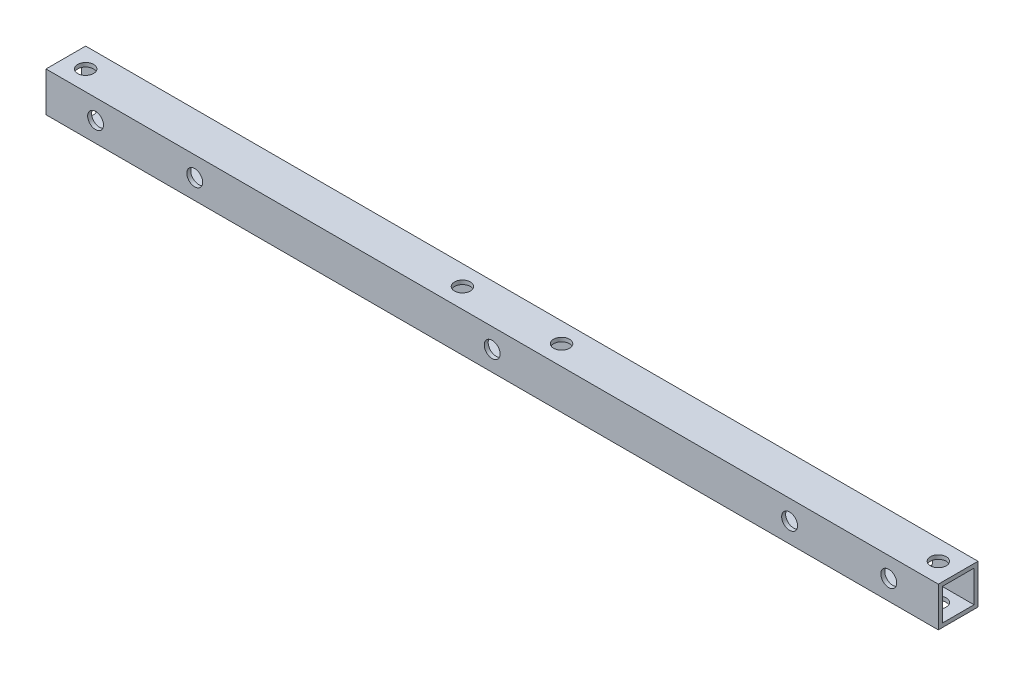
ISO-10303-21;
HEADER;
FILE_DESCRIPTION(('STEP AP214'),'2;1');
FILE_NAME('part.step','',(''),(''),'','','');
FILE_SCHEMA(('AUTOMOTIVE_DESIGN { 1 0 10303 214 1 1 1 1 }'));
ENDSEC;
DATA;
#1=APPLICATION_CONTEXT('core data for automotive mechanical design processes');
#2=APPLICATION_PROTOCOL_DEFINITION('international standard','automotive_design',2000,#1);
#3=PRODUCT_CONTEXT('',#1,'mechanical');
#4=PRODUCT('Part','Part','',(#3));
#5=PRODUCT_RELATED_PRODUCT_CATEGORY('part','',(#4));
#6=PRODUCT_DEFINITION_FORMATION('','',#4);
#7=PRODUCT_DEFINITION_CONTEXT('part definition',#1,'design');
#8=PRODUCT_DEFINITION('design','',#6,#7);
#9=PRODUCT_DEFINITION_SHAPE('','',#8);
#10=(LENGTH_UNIT() NAMED_UNIT(*) SI_UNIT(.MILLI.,.METRE.));
#11=(NAMED_UNIT(*) PLANE_ANGLE_UNIT() SI_UNIT($,.RADIAN.));
#12=(NAMED_UNIT(*) SI_UNIT($,.STERADIAN.) SOLID_ANGLE_UNIT());
#13=UNCERTAINTY_MEASURE_WITH_UNIT(LENGTH_MEASURE(1.E-05),#10,'distance_accuracy_value','');
#14=(GEOMETRIC_REPRESENTATION_CONTEXT(3) GLOBAL_UNCERTAINTY_ASSIGNED_CONTEXT((#13)) GLOBAL_UNIT_ASSIGNED_CONTEXT((#10,
#11,#12)) REPRESENTATION_CONTEXT('',''));
#15=CARTESIAN_POINT('',(0.,0.,0.));
#16=DIRECTION('',(0.,0.,1.));
#17=DIRECTION('',(1.,0.,0.));
#18=AXIS2_PLACEMENT_3D('',#15,#16,#17);
#19=CARTESIAN_POINT('',(225.,0.,0.));
#20=DIRECTION('',(1.,0.,0.));
#21=DIRECTION('',(0.,0.,-1.));
#22=AXIS2_PLACEMENT_3D('',#19,#20,#21);
#23=PLANE('',#22);
#24=DIRECTION('',(0.,1.,0.));
#25=VECTOR('',#24,1.);
#26=CARTESIAN_POINT('',(225.,5.,-5.));
#27=LINE('',#26,#25);
#28=CARTESIAN_POINT('',(225.,-5.,-5.));
#29=VERTEX_POINT('',#28);
#30=CARTESIAN_POINT('',(225.,5.,-5.));
#31=VERTEX_POINT('',#30);
#32=EDGE_CURVE('E166',#29,#31,#27,.T.);
#33=ORIENTED_EDGE('',*,*,#32,.T.);
#34=DIRECTION('',(0.,0.,1.));
#35=VECTOR('',#34,1.);
#36=CARTESIAN_POINT('',(225.,5.,5.));
#37=LINE('',#36,#35);
#38=CARTESIAN_POINT('',(225.,5.,5.));
#39=VERTEX_POINT('',#38);
#40=EDGE_CURVE('E169',#31,#39,#37,.T.);
#41=ORIENTED_EDGE('',*,*,#40,.T.);
#42=DIRECTION('',(0.,-1.,0.));
#43=VECTOR('',#42,1.);
#44=CARTESIAN_POINT('',(225.,5.,5.));
#45=LINE('',#44,#43);
#46=CARTESIAN_POINT('',(225.,-5.,5.));
#47=VERTEX_POINT('',#46);
#48=EDGE_CURVE('E172',#39,#47,#45,.T.);
#49=ORIENTED_EDGE('',*,*,#48,.T.);
#50=DIRECTION('',(0.,0.,-1.));
#51=VECTOR('',#50,1.);
#52=CARTESIAN_POINT('',(225.,-5.,5.));
#53=LINE('',#52,#51);
#54=EDGE_CURVE('E174',#47,#29,#53,.T.);
#55=ORIENTED_EDGE('',*,*,#54,.T.);
#56=EDGE_LOOP('',(#33,#41,#49,#55));
#57=FACE_BOUND('',#56,.T.);
#58=DIRECTION('',(0.,0.,1.));
#59=VECTOR('',#58,1.);
#60=CARTESIAN_POINT('',(225.,4.,5.));
#61=LINE('',#60,#59);
#62=CARTESIAN_POINT('',(225.,4.,-4.));
#63=VERTEX_POINT('',#62);
#64=CARTESIAN_POINT('',(225.,4.,4.));
#65=VERTEX_POINT('',#64);
#66=EDGE_CURVE('E136',#63,#65,#61,.T.);
#67=ORIENTED_EDGE('',*,*,#66,.F.);
#68=DIRECTION('',(0.,1.,0.));
#69=VECTOR('',#68,1.);
#70=CARTESIAN_POINT('',(225.,5.,-4.));
#71=LINE('',#70,#69);
#72=CARTESIAN_POINT('',(225.,-4.,-4.));
#73=VERTEX_POINT('',#72);
#74=EDGE_CURVE('E128',#73,#63,#71,.T.);
#75=ORIENTED_EDGE('',*,*,#74,.F.);
#76=DIRECTION('',(0.,0.,-1.));
#77=VECTOR('',#76,1.);
#78=CARTESIAN_POINT('',(225.,-4.,5.));
#79=LINE('',#78,#77);
#80=CARTESIAN_POINT('',(225.,-4.,4.));
#81=VERTEX_POINT('',#80);
#82=EDGE_CURVE('E150',#81,#73,#79,.T.);
#83=ORIENTED_EDGE('',*,*,#82,.F.);
#84=DIRECTION('',(0.,-1.,0.));
#85=VECTOR('',#84,1.);
#86=CARTESIAN_POINT('',(225.,5.,4.));
#87=LINE('',#86,#85);
#88=EDGE_CURVE('E148',#65,#81,#87,.T.);
#89=ORIENTED_EDGE('',*,*,#88,.F.);
#90=EDGE_LOOP('',(#67,#75,#83,#89));
#91=FACE_BOUND('',#90,.T.);
#92=ADVANCED_FACE('F61',(#57,#91),#23,.T.);
#93=CARTESIAN_POINT('',(0.,0.,0.));
#94=DIRECTION('',(1.,0.,0.));
#95=DIRECTION('',(0.,0.,-1.));
#96=AXIS2_PLACEMENT_3D('',#93,#94,#95);
#97=PLANE('',#96);
#98=DIRECTION('',(0.,1.,0.));
#99=VECTOR('',#98,1.);
#100=CARTESIAN_POINT('',(0.,5.,-5.));
#101=LINE('',#100,#99);
#102=CARTESIAN_POINT('',(0.,-5.,-5.));
#103=VERTEX_POINT('',#102);
#104=CARTESIAN_POINT('',(0.,5.,-5.));
#105=VERTEX_POINT('',#104);
#106=EDGE_CURVE('E144',#103,#105,#101,.T.);
#107=ORIENTED_EDGE('',*,*,#106,.F.);
#108=DIRECTION('',(0.,0.,-1.));
#109=VECTOR('',#108,1.);
#110=CARTESIAN_POINT('',(0.,-5.,5.));
#111=LINE('',#110,#109);
#112=CARTESIAN_POINT('',(0.,-5.,5.));
#113=VERTEX_POINT('',#112);
#114=EDGE_CURVE('E170',#113,#103,#111,.T.);
#115=ORIENTED_EDGE('',*,*,#114,.F.);
#116=DIRECTION('',(0.,-1.,0.));
#117=VECTOR('',#116,1.);
#118=CARTESIAN_POINT('',(0.,5.,5.));
#119=LINE('',#118,#117);
#120=CARTESIAN_POINT('',(0.,5.,5.));
#121=VERTEX_POINT('',#120);
#122=EDGE_CURVE('E181',#121,#113,#119,.T.);
#123=ORIENTED_EDGE('',*,*,#122,.F.);
#124=DIRECTION('',(0.,0.,1.));
#125=VECTOR('',#124,1.);
#126=CARTESIAN_POINT('',(0.,5.,5.));
#127=LINE('',#126,#125);
#128=EDGE_CURVE('E179',#105,#121,#127,.T.);
#129=ORIENTED_EDGE('',*,*,#128,.F.);
#130=EDGE_LOOP('',(#107,#115,#123,#129));
#131=FACE_BOUND('',#130,.T.);
#132=DIRECTION('',(0.,1.,0.));
#133=VECTOR('',#132,1.);
#134=CARTESIAN_POINT('',(0.,5.,-4.));
#135=LINE('',#134,#133);
#136=CARTESIAN_POINT('',(0.,-4.,-4.));
#137=VERTEX_POINT('',#136);
#138=CARTESIAN_POINT('',(0.,4.,-4.));
#139=VERTEX_POINT('',#138);
#140=EDGE_CURVE('E86',#137,#139,#135,.T.);
#141=ORIENTED_EDGE('',*,*,#140,.T.);
#142=DIRECTION('',(0.,0.,1.));
#143=VECTOR('',#142,1.);
#144=CARTESIAN_POINT('',(0.,4.,5.));
#145=LINE('',#144,#143);
#146=CARTESIAN_POINT('',(0.,4.,4.));
#147=VERTEX_POINT('',#146);
#148=EDGE_CURVE('E143',#139,#147,#145,.T.);
#149=ORIENTED_EDGE('',*,*,#148,.T.);
#150=DIRECTION('',(0.,-1.,0.));
#151=VECTOR('',#150,1.);
#152=CARTESIAN_POINT('',(0.,5.,4.));
#153=LINE('',#152,#151);
#154=CARTESIAN_POINT('',(0.,-4.,4.));
#155=VERTEX_POINT('',#154);
#156=EDGE_CURVE('E158',#147,#155,#153,.T.);
#157=ORIENTED_EDGE('',*,*,#156,.T.);
#158=DIRECTION('',(0.,0.,-1.));
#159=VECTOR('',#158,1.);
#160=CARTESIAN_POINT('',(0.,-4.,5.));
#161=LINE('',#160,#159);
#162=EDGE_CURVE('E137',#155,#137,#161,.T.);
#163=ORIENTED_EDGE('',*,*,#162,.T.);
#164=EDGE_LOOP('',(#141,#149,#157,#163));
#165=FACE_BOUND('',#164,.T.);
#166=ADVANCED_FACE('F302',(#131,#165),#97,.F.);
#167=CARTESIAN_POINT('',(225.,5.,-5.));
#168=DIRECTION('',(0.,0.,1.));
#169=DIRECTION('',(0.,-1.,0.));
#170=AXIS2_PLACEMENT_3D('',#167,#168,#169);
#171=PLANE('',#170);
#172=CARTESIAN_POINT('',(187.5,0.,-5.));
#173=DIRECTION('',(0.,0.,1.));
#174=DIRECTION('',(-1.,0.,0.));
#175=AXIS2_PLACEMENT_3D('',#172,#173,#174);
#176=CIRCLE('',#175,2.);
#177=CARTESIAN_POINT('',(185.5,0.,-5.));
#178=VERTEX_POINT('',#177);
#179=EDGE_CURVE('E249',#178,#178,#176,.T.);
#180=ORIENTED_EDGE('',*,*,#179,.T.);
#181=EDGE_LOOP('',(#180));
#182=FACE_BOUND('',#181,.T.);
#183=CARTESIAN_POINT('',(112.5,0.,-5.));
#184=DIRECTION('',(0.,0.,1.));
#185=DIRECTION('',(1.,0.,0.));
#186=AXIS2_PLACEMENT_3D('',#183,#184,#185);
#187=CIRCLE('',#186,2.);
#188=CARTESIAN_POINT('',(114.5,0.,-5.));
#189=VERTEX_POINT('',#188);
#190=EDGE_CURVE('E256',#189,#189,#187,.T.);
#191=ORIENTED_EDGE('',*,*,#190,.T.);
#192=EDGE_LOOP('',(#191));
#193=FACE_BOUND('',#192,.T.);
#194=CARTESIAN_POINT('',(12.5,0.,-5.));
#195=DIRECTION('',(0.,0.,1.));
#196=DIRECTION('',(1.,0.,0.));
#197=AXIS2_PLACEMENT_3D('',#194,#195,#196);
#198=CIRCLE('',#197,2.);
#199=CARTESIAN_POINT('',(14.5,0.,-5.));
#200=VERTEX_POINT('',#199);
#201=EDGE_CURVE('E237',#200,#200,#198,.T.);
#202=ORIENTED_EDGE('',*,*,#201,.T.);
#203=EDGE_LOOP('',(#202));
#204=FACE_BOUND('',#203,.T.);
#205=CARTESIAN_POINT('',(212.5,0.,-5.));
#206=DIRECTION('',(0.,0.,1.));
#207=DIRECTION('',(-1.,0.,0.));
#208=AXIS2_PLACEMENT_3D('',#205,#206,#207);
#209=CIRCLE('',#208,2.);
#210=CARTESIAN_POINT('',(210.5,0.,-5.));
#211=VERTEX_POINT('',#210);
#212=EDGE_CURVE('E244',#211,#211,#209,.T.);
#213=ORIENTED_EDGE('',*,*,#212,.T.);
#214=EDGE_LOOP('',(#213));
#215=FACE_BOUND('',#214,.T.);
#216=CARTESIAN_POINT('',(37.5,0.,-5.));
#217=DIRECTION('',(0.,0.,1.));
#218=DIRECTION('',(1.,0.,0.));
#219=AXIS2_PLACEMENT_3D('',#216,#217,#218);
#220=CIRCLE('',#219,2.);
#221=CARTESIAN_POINT('',(39.5,0.,-5.));
#222=VERTEX_POINT('',#221);
#223=EDGE_CURVE('E195',#222,#222,#220,.T.);
#224=ORIENTED_EDGE('',*,*,#223,.T.);
#225=EDGE_LOOP('',(#224));
#226=FACE_BOUND('',#225,.T.);
#227=ORIENTED_EDGE('',*,*,#106,.T.);
#228=DIRECTION('',(-1.,0.,0.));
#229=VECTOR('',#228,1.);
#230=CARTESIAN_POINT('',(225.,5.,-5.));
#231=LINE('',#230,#229);
#232=EDGE_CURVE('E12',#31,#105,#231,.T.);
#233=ORIENTED_EDGE('',*,*,#232,.F.);
#234=ORIENTED_EDGE('',*,*,#32,.F.);
#235=DIRECTION('',(-1.,0.,0.));
#236=VECTOR('',#235,1.);
#237=CARTESIAN_POINT('',(225.,-5.,-5.));
#238=LINE('',#237,#236);
#239=EDGE_CURVE('E176',#29,#103,#238,.T.);
#240=ORIENTED_EDGE('',*,*,#239,.T.);
#241=EDGE_LOOP('',(#227,#233,#234,#240));
#242=FACE_BOUND('',#241,.T.);
#243=ADVANCED_FACE('F63',(#182,#193,#204,#215,#226,#242),#171,.F.);
#244=CARTESIAN_POINT('',(225.,5.,5.));
#245=DIRECTION('',(0.,-1.,0.));
#246=DIRECTION('',(0.,0.,-1.));
#247=AXIS2_PLACEMENT_3D('',#244,#245,#246);
#248=PLANE('',#247);
#249=CARTESIAN_POINT('',(5.,5.,0.));
#250=DIRECTION('',(0.,1.,0.));
#251=DIRECTION('',(0.,0.,1.));
#252=AXIS2_PLACEMENT_3D('',#249,#250,#251);
#253=CIRCLE('',#252,2.);
#254=CARTESIAN_POINT('',(5.,5.,2.));
#255=VERTEX_POINT('',#254);
#256=EDGE_CURVE('E404',#255,#255,#253,.T.);
#257=ORIENTED_EDGE('',*,*,#256,.F.);
#258=EDGE_LOOP('',(#257));
#259=FACE_BOUND('',#258,.T.);
#260=CARTESIAN_POINT('',(125.,5.,0.));
#261=DIRECTION('',(0.,1.,0.));
#262=DIRECTION('',(0.,0.,-1.));
#263=AXIS2_PLACEMENT_3D('',#260,#261,#262);
#264=CIRCLE('',#263,2.);
#265=CARTESIAN_POINT('',(125.,5.,-2.));
#266=VERTEX_POINT('',#265);
#267=EDGE_CURVE('E417',#266,#266,#264,.T.);
#268=ORIENTED_EDGE('',*,*,#267,.F.);
#269=EDGE_LOOP('',(#268));
#270=FACE_BOUND('',#269,.T.);
#271=CARTESIAN_POINT('',(100.,5.,0.));
#272=DIRECTION('',(0.,1.,0.));
#273=DIRECTION('',(0.,0.,1.));
#274=AXIS2_PLACEMENT_3D('',#271,#272,#273);
#275=CIRCLE('',#274,2.);
#276=CARTESIAN_POINT('',(100.,5.,2.));
#277=VERTEX_POINT('',#276);
#278=EDGE_CURVE('E416',#277,#277,#275,.T.);
#279=ORIENTED_EDGE('',*,*,#278,.F.);
#280=EDGE_LOOP('',(#279));
#281=FACE_BOUND('',#280,.T.);
#282=CARTESIAN_POINT('',(220.,5.,0.));
#283=DIRECTION('',(0.,1.,0.));
#284=DIRECTION('',(0.,0.,-1.));
#285=AXIS2_PLACEMENT_3D('',#282,#283,#284);
#286=CIRCLE('',#285,2.);
#287=CARTESIAN_POINT('',(220.,5.,-2.));
#288=VERTEX_POINT('',#287);
#289=EDGE_CURVE('E410',#288,#288,#286,.T.);
#290=ORIENTED_EDGE('',*,*,#289,.F.);
#291=EDGE_LOOP('',(#290));
#292=FACE_BOUND('',#291,.T.);
#293=ORIENTED_EDGE('',*,*,#128,.T.);
#294=DIRECTION('',(-1.,0.,0.));
#295=VECTOR('',#294,1.);
#296=CARTESIAN_POINT('',(225.,5.,5.));
#297=LINE('',#296,#295);
#298=EDGE_CURVE('E70',#39,#121,#297,.T.);
#299=ORIENTED_EDGE('',*,*,#298,.F.);
#300=ORIENTED_EDGE('',*,*,#40,.F.);
#301=ORIENTED_EDGE('',*,*,#232,.T.);
#302=EDGE_LOOP('',(#293,#299,#300,#301));
#303=FACE_BOUND('',#302,.T.);
#304=ADVANCED_FACE('F301',(#259,#270,#281,#292,#303),#248,.F.);
#305=CARTESIAN_POINT('',(225.,5.,5.));
#306=DIRECTION('',(0.,0.,-1.));
#307=DIRECTION('',(0.,1.,0.));
#308=AXIS2_PLACEMENT_3D('',#305,#306,#307);
#309=PLANE('',#308);
#310=CARTESIAN_POINT('',(187.5,0.,5.));
#311=DIRECTION('',(0.,0.,1.));
#312=DIRECTION('',(-1.,0.,0.));
#313=AXIS2_PLACEMENT_3D('',#310,#311,#312);
#314=CIRCLE('',#313,2.);
#315=CARTESIAN_POINT('',(185.5,0.,5.));
#316=VERTEX_POINT('',#315);
#317=EDGE_CURVE('E253',#316,#316,#314,.T.);
#318=ORIENTED_EDGE('',*,*,#317,.F.);
#319=EDGE_LOOP('',(#318));
#320=FACE_BOUND('',#319,.T.);
#321=CARTESIAN_POINT('',(112.5,0.,5.));
#322=DIRECTION('',(0.,0.,1.));
#323=DIRECTION('',(1.,0.,0.));
#324=AXIS2_PLACEMENT_3D('',#321,#322,#323);
#325=CIRCLE('',#324,2.);
#326=CARTESIAN_POINT('',(114.5,0.,5.));
#327=VERTEX_POINT('',#326);
#328=EDGE_CURVE('E240',#327,#327,#325,.T.);
#329=ORIENTED_EDGE('',*,*,#328,.F.);
#330=EDGE_LOOP('',(#329));
#331=FACE_BOUND('',#330,.T.);
#332=CARTESIAN_POINT('',(12.5,0.,5.));
#333=DIRECTION('',(0.,0.,1.));
#334=DIRECTION('',(1.,0.,0.));
#335=AXIS2_PLACEMENT_3D('',#332,#333,#334);
#336=CIRCLE('',#335,2.);
#337=CARTESIAN_POINT('',(14.5,0.,5.));
#338=VERTEX_POINT('',#337);
#339=EDGE_CURVE('E241',#338,#338,#336,.T.);
#340=ORIENTED_EDGE('',*,*,#339,.F.);
#341=EDGE_LOOP('',(#340));
#342=FACE_BOUND('',#341,.T.);
#343=CARTESIAN_POINT('',(212.5,0.,5.));
#344=DIRECTION('',(0.,0.,1.));
#345=DIRECTION('',(-1.,0.,0.));
#346=AXIS2_PLACEMENT_3D('',#343,#344,#345);
#347=CIRCLE('',#346,2.);
#348=CARTESIAN_POINT('',(210.5,0.,5.));
#349=VERTEX_POINT('',#348);
#350=EDGE_CURVE('E236',#349,#349,#347,.T.);
#351=ORIENTED_EDGE('',*,*,#350,.F.);
#352=EDGE_LOOP('',(#351));
#353=FACE_BOUND('',#352,.T.);
#354=CARTESIAN_POINT('',(37.5,0.,5.));
#355=DIRECTION('',(0.,0.,1.));
#356=DIRECTION('',(1.,0.,0.));
#357=AXIS2_PLACEMENT_3D('',#354,#355,#356);
#358=CIRCLE('',#357,2.);
#359=CARTESIAN_POINT('',(39.5,0.,5.));
#360=VERTEX_POINT('',#359);
#361=EDGE_CURVE('E252',#360,#360,#358,.T.);
#362=ORIENTED_EDGE('',*,*,#361,.F.);
#363=EDGE_LOOP('',(#362));
#364=FACE_BOUND('',#363,.T.);
#365=ORIENTED_EDGE('',*,*,#122,.T.);
#366=DIRECTION('',(-1.,0.,0.));
#367=VECTOR('',#366,1.);
#368=CARTESIAN_POINT('',(225.,-5.,5.));
#369=LINE('',#368,#367);
#370=EDGE_CURVE('E186',#47,#113,#369,.T.);
#371=ORIENTED_EDGE('',*,*,#370,.F.);
#372=ORIENTED_EDGE('',*,*,#48,.F.);
#373=ORIENTED_EDGE('',*,*,#298,.T.);
#374=EDGE_LOOP('',(#365,#371,#372,#373));
#375=FACE_BOUND('',#374,.T.);
#376=ADVANCED_FACE('F320',(#320,#331,#342,#353,#364,#375),#309,.F.);
#377=CARTESIAN_POINT('',(225.,-5.,5.));
#378=DIRECTION('',(0.,1.,0.));
#379=DIRECTION('',(0.,0.,1.));
#380=AXIS2_PLACEMENT_3D('',#377,#378,#379);
#381=PLANE('',#380);
#382=CARTESIAN_POINT('',(5.,-5.,0.));
#383=DIRECTION('',(0.,1.,0.));
#384=DIRECTION('',(0.,0.,1.));
#385=AXIS2_PLACEMENT_3D('',#382,#383,#384);
#386=CIRCLE('',#385,2.);
#387=CARTESIAN_POINT('',(5.,-5.,2.));
#388=VERTEX_POINT('',#387);
#389=EDGE_CURVE('E215',#388,#388,#386,.T.);
#390=ORIENTED_EDGE('',*,*,#389,.T.);
#391=EDGE_LOOP('',(#390));
#392=FACE_BOUND('',#391,.T.);
#393=CARTESIAN_POINT('',(125.,-5.,0.));
#394=DIRECTION('',(0.,1.,0.));
#395=DIRECTION('',(0.,0.,-1.));
#396=AXIS2_PLACEMENT_3D('',#393,#394,#395);
#397=CIRCLE('',#396,2.);
#398=CARTESIAN_POINT('',(125.,-5.,-2.));
#399=VERTEX_POINT('',#398);
#400=EDGE_CURVE('E413',#399,#399,#397,.T.);
#401=ORIENTED_EDGE('',*,*,#400,.T.);
#402=EDGE_LOOP('',(#401));
#403=FACE_BOUND('',#402,.T.);
#404=CARTESIAN_POINT('',(100.,-5.,0.));
#405=DIRECTION('',(0.,1.,0.));
#406=DIRECTION('',(0.,0.,1.));
#407=AXIS2_PLACEMENT_3D('',#404,#405,#406);
#408=CIRCLE('',#407,2.);
#409=CARTESIAN_POINT('',(100.,-5.,2.));
#410=VERTEX_POINT('',#409);
#411=EDGE_CURVE('E422',#410,#410,#408,.T.);
#412=ORIENTED_EDGE('',*,*,#411,.T.);
#413=EDGE_LOOP('',(#412));
#414=FACE_BOUND('',#413,.T.);
#415=CARTESIAN_POINT('',(220.,-5.,0.));
#416=DIRECTION('',(0.,1.,0.));
#417=DIRECTION('',(0.,0.,-1.));
#418=AXIS2_PLACEMENT_3D('',#415,#416,#417);
#419=CIRCLE('',#418,2.);
#420=CARTESIAN_POINT('',(220.,-5.,-2.));
#421=VERTEX_POINT('',#420);
#422=EDGE_CURVE('E405',#421,#421,#419,.T.);
#423=ORIENTED_EDGE('',*,*,#422,.T.);
#424=EDGE_LOOP('',(#423));
#425=FACE_BOUND('',#424,.T.);
#426=ORIENTED_EDGE('',*,*,#114,.T.);
#427=ORIENTED_EDGE('',*,*,#239,.F.);
#428=ORIENTED_EDGE('',*,*,#54,.F.);
#429=ORIENTED_EDGE('',*,*,#370,.T.);
#430=EDGE_LOOP('',(#426,#427,#428,#429));
#431=FACE_BOUND('',#430,.T.);
#432=ADVANCED_FACE('F280',(#392,#403,#414,#425,#431),#381,.F.);
#433=CARTESIAN_POINT('',(225.,5.,-4.));
#434=DIRECTION('',(0.,0.,1.));
#435=DIRECTION('',(0.,-1.,0.));
#436=AXIS2_PLACEMENT_3D('',#433,#434,#435);
#437=PLANE('',#436);
#438=CARTESIAN_POINT('',(187.5,0.,-4.));
#439=DIRECTION('',(0.,0.,1.));
#440=DIRECTION('',(0.,-1.,0.));
#441=AXIS2_PLACEMENT_3D('',#438,#439,#440);
#442=CIRCLE('',#441,2.);
#443=CARTESIAN_POINT('',(187.5,-1.99999999999998,-4.));
#444=VERTEX_POINT('',#443);
#445=EDGE_CURVE('E156',#444,#444,#442,.T.);
#446=ORIENTED_EDGE('',*,*,#445,.F.);
#447=EDGE_LOOP('',(#446));
#448=FACE_BOUND('',#447,.T.);
#449=CARTESIAN_POINT('',(112.5,0.,-4.));
#450=DIRECTION('',(0.,0.,1.));
#451=DIRECTION('',(0.,-1.,0.));
#452=AXIS2_PLACEMENT_3D('',#449,#450,#451);
#453=CIRCLE('',#452,2.);
#454=CARTESIAN_POINT('',(112.5,-2.,-4.));
#455=VERTEX_POINT('',#454);
#456=EDGE_CURVE('E207',#455,#455,#453,.T.);
#457=ORIENTED_EDGE('',*,*,#456,.F.);
#458=EDGE_LOOP('',(#457));
#459=FACE_BOUND('',#458,.T.);
#460=CARTESIAN_POINT('',(12.5,0.,-4.));
#461=DIRECTION('',(0.,0.,1.));
#462=DIRECTION('',(0.,-1.,0.));
#463=AXIS2_PLACEMENT_3D('',#460,#461,#462);
#464=CIRCLE('',#463,2.);
#465=CARTESIAN_POINT('',(12.5,-2.,-4.));
#466=VERTEX_POINT('',#465);
#467=EDGE_CURVE('E203',#466,#466,#464,.T.);
#468=ORIENTED_EDGE('',*,*,#467,.F.);
#469=EDGE_LOOP('',(#468));
#470=FACE_BOUND('',#469,.T.);
#471=CARTESIAN_POINT('',(212.5,0.,-4.));
#472=DIRECTION('',(0.,0.,1.));
#473=DIRECTION('',(0.,-1.,0.));
#474=AXIS2_PLACEMENT_3D('',#471,#472,#473);
#475=CIRCLE('',#474,2.);
#476=CARTESIAN_POINT('',(212.5,-2.,-4.));
#477=VERTEX_POINT('',#476);
#478=EDGE_CURVE('E199',#477,#477,#475,.T.);
#479=ORIENTED_EDGE('',*,*,#478,.F.);
#480=EDGE_LOOP('',(#479));
#481=FACE_BOUND('',#480,.T.);
#482=CARTESIAN_POINT('',(37.5,0.,-4.));
#483=DIRECTION('',(0.,0.,1.));
#484=DIRECTION('',(0.,-1.,0.));
#485=AXIS2_PLACEMENT_3D('',#482,#483,#484);
#486=CIRCLE('',#485,2.);
#487=CARTESIAN_POINT('',(37.5,-2.,-4.));
#488=VERTEX_POINT('',#487);
#489=EDGE_CURVE('E194',#488,#488,#486,.T.);
#490=ORIENTED_EDGE('',*,*,#489,.F.);
#491=EDGE_LOOP('',(#490));
#492=FACE_BOUND('',#491,.T.);
#493=ORIENTED_EDGE('',*,*,#140,.F.);
#494=DIRECTION('',(-1.,0.,0.));
#495=VECTOR('',#494,1.);
#496=CARTESIAN_POINT('',(225.,-4.,-4.));
#497=LINE('',#496,#495);
#498=EDGE_CURVE('E132',#73,#137,#497,.T.);
#499=ORIENTED_EDGE('',*,*,#498,.F.);
#500=ORIENTED_EDGE('',*,*,#74,.T.);
#501=DIRECTION('',(-1.,0.,0.));
#502=VECTOR('',#501,1.);
#503=CARTESIAN_POINT('',(225.,4.,-4.));
#504=LINE('',#503,#502);
#505=EDGE_CURVE('E131',#63,#139,#504,.T.);
#506=ORIENTED_EDGE('',*,*,#505,.T.);
#507=EDGE_LOOP('',(#493,#499,#500,#506));
#508=FACE_BOUND('',#507,.T.);
#509=ADVANCED_FACE('F130',(#448,#459,#470,#481,#492,#508),#437,.T.);
#510=CARTESIAN_POINT('',(225.,4.,5.));
#511=DIRECTION('',(0.,-1.,0.));
#512=DIRECTION('',(0.,0.,-1.));
#513=AXIS2_PLACEMENT_3D('',#510,#511,#512);
#514=PLANE('',#513);
#515=CARTESIAN_POINT('',(5.,4.,0.));
#516=DIRECTION('',(0.,-1.,0.));
#517=DIRECTION('',(0.,0.,-1.));
#518=AXIS2_PLACEMENT_3D('',#515,#516,#517);
#519=CIRCLE('',#518,2.);
#520=CARTESIAN_POINT('',(5.,4.,-2.));
#521=VERTEX_POINT('',#520);
#522=EDGE_CURVE('E233',#521,#521,#519,.T.);
#523=ORIENTED_EDGE('',*,*,#522,.F.);
#524=EDGE_LOOP('',(#523));
#525=FACE_BOUND('',#524,.T.);
#526=CARTESIAN_POINT('',(125.,4.,0.));
#527=DIRECTION('',(0.,-1.,0.));
#528=DIRECTION('',(0.,0.,-1.));
#529=AXIS2_PLACEMENT_3D('',#526,#527,#528);
#530=CIRCLE('',#529,2.);
#531=CARTESIAN_POINT('',(125.,4.,-2.));
#532=VERTEX_POINT('',#531);
#533=EDGE_CURVE('E221',#532,#532,#530,.T.);
#534=ORIENTED_EDGE('',*,*,#533,.F.);
#535=EDGE_LOOP('',(#534));
#536=FACE_BOUND('',#535,.T.);
#537=CARTESIAN_POINT('',(100.,4.,0.));
#538=DIRECTION('',(0.,-1.,0.));
#539=DIRECTION('',(0.,0.,-1.));
#540=AXIS2_PLACEMENT_3D('',#537,#538,#539);
#541=CIRCLE('',#540,2.);
#542=CARTESIAN_POINT('',(100.,4.,-1.99999999999999));
#543=VERTEX_POINT('',#542);
#544=EDGE_CURVE('E218',#543,#543,#541,.T.);
#545=ORIENTED_EDGE('',*,*,#544,.F.);
#546=EDGE_LOOP('',(#545));
#547=FACE_BOUND('',#546,.T.);
#548=CARTESIAN_POINT('',(220.,4.,0.));
#549=DIRECTION('',(0.,-1.,0.));
#550=DIRECTION('',(0.,0.,-1.));
#551=AXIS2_PLACEMENT_3D('',#548,#549,#550);
#552=CIRCLE('',#551,2.);
#553=CARTESIAN_POINT('',(220.,4.,-2.));
#554=VERTEX_POINT('',#553);
#555=EDGE_CURVE('E214',#554,#554,#552,.T.);
#556=ORIENTED_EDGE('',*,*,#555,.F.);
#557=EDGE_LOOP('',(#556));
#558=FACE_BOUND('',#557,.T.);
#559=ORIENTED_EDGE('',*,*,#148,.F.);
#560=ORIENTED_EDGE('',*,*,#505,.F.);
#561=ORIENTED_EDGE('',*,*,#66,.T.);
#562=DIRECTION('',(-1.,0.,0.));
#563=VECTOR('',#562,1.);
#564=CARTESIAN_POINT('',(225.,4.,4.));
#565=LINE('',#564,#563);
#566=EDGE_CURVE('E145',#65,#147,#565,.T.);
#567=ORIENTED_EDGE('',*,*,#566,.T.);
#568=EDGE_LOOP('',(#559,#560,#561,#567));
#569=FACE_BOUND('',#568,.T.);
#570=ADVANCED_FACE('F140',(#525,#536,#547,#558,#569),#514,.T.);
#571=CARTESIAN_POINT('',(225.,5.,4.));
#572=DIRECTION('',(0.,0.,-1.));
#573=DIRECTION('',(0.,1.,0.));
#574=AXIS2_PLACEMENT_3D('',#571,#572,#573);
#575=PLANE('',#574);
#576=CARTESIAN_POINT('',(187.5,0.,4.));
#577=DIRECTION('',(0.,0.,-1.));
#578=DIRECTION('',(0.,1.,0.));
#579=AXIS2_PLACEMENT_3D('',#576,#577,#578);
#580=CIRCLE('',#579,2.);
#581=CARTESIAN_POINT('',(187.5,2.00000000000001,4.));
#582=VERTEX_POINT('',#581);
#583=EDGE_CURVE('E208',#582,#582,#580,.T.);
#584=ORIENTED_EDGE('',*,*,#583,.F.);
#585=EDGE_LOOP('',(#584));
#586=FACE_BOUND('',#585,.T.);
#587=CARTESIAN_POINT('',(112.5,0.,4.));
#588=DIRECTION('',(0.,0.,-1.));
#589=DIRECTION('',(0.,1.,0.));
#590=AXIS2_PLACEMENT_3D('',#587,#588,#589);
#591=CIRCLE('',#590,2.);
#592=CARTESIAN_POINT('',(112.5,2.,4.));
#593=VERTEX_POINT('',#592);
#594=EDGE_CURVE('E204',#593,#593,#591,.T.);
#595=ORIENTED_EDGE('',*,*,#594,.F.);
#596=EDGE_LOOP('',(#595));
#597=FACE_BOUND('',#596,.T.);
#598=CARTESIAN_POINT('',(12.5,0.,4.));
#599=DIRECTION('',(0.,0.,-1.));
#600=DIRECTION('',(0.,1.,0.));
#601=AXIS2_PLACEMENT_3D('',#598,#599,#600);
#602=CIRCLE('',#601,2.);
#603=CARTESIAN_POINT('',(12.5,2.,4.));
#604=VERTEX_POINT('',#603);
#605=EDGE_CURVE('E200',#604,#604,#602,.T.);
#606=ORIENTED_EDGE('',*,*,#605,.F.);
#607=EDGE_LOOP('',(#606));
#608=FACE_BOUND('',#607,.T.);
#609=CARTESIAN_POINT('',(212.5,0.,4.));
#610=DIRECTION('',(0.,0.,-1.));
#611=DIRECTION('',(0.,1.,0.));
#612=AXIS2_PLACEMENT_3D('',#609,#610,#611);
#613=CIRCLE('',#612,2.);
#614=CARTESIAN_POINT('',(212.5,2.,4.));
#615=VERTEX_POINT('',#614);
#616=EDGE_CURVE('E196',#615,#615,#613,.T.);
#617=ORIENTED_EDGE('',*,*,#616,.F.);
#618=EDGE_LOOP('',(#617));
#619=FACE_BOUND('',#618,.T.);
#620=CARTESIAN_POINT('',(37.5,0.,4.));
#621=DIRECTION('',(0.,0.,-1.));
#622=DIRECTION('',(0.,1.,0.));
#623=AXIS2_PLACEMENT_3D('',#620,#621,#622);
#624=CIRCLE('',#623,2.);
#625=CARTESIAN_POINT('',(37.5,2.,4.));
#626=VERTEX_POINT('',#625);
#627=EDGE_CURVE('E191',#626,#626,#624,.T.);
#628=ORIENTED_EDGE('',*,*,#627,.F.);
#629=EDGE_LOOP('',(#628));
#630=FACE_BOUND('',#629,.T.);
#631=ORIENTED_EDGE('',*,*,#156,.F.);
#632=ORIENTED_EDGE('',*,*,#566,.F.);
#633=ORIENTED_EDGE('',*,*,#88,.T.);
#634=DIRECTION('',(-1.,0.,0.));
#635=VECTOR('',#634,1.);
#636=CARTESIAN_POINT('',(225.,-4.,4.));
#637=LINE('',#636,#635);
#638=EDGE_CURVE('E78',#81,#155,#637,.T.);
#639=ORIENTED_EDGE('',*,*,#638,.T.);
#640=EDGE_LOOP('',(#631,#632,#633,#639));
#641=FACE_BOUND('',#640,.T.);
#642=ADVANCED_FACE('F342',(#586,#597,#608,#619,#630,#641),#575,.T.);
#643=CARTESIAN_POINT('',(225.,-4.,5.));
#644=DIRECTION('',(0.,1.,0.));
#645=DIRECTION('',(0.,0.,1.));
#646=AXIS2_PLACEMENT_3D('',#643,#644,#645);
#647=PLANE('',#646);
#648=CARTESIAN_POINT('',(5.,-4.,0.));
#649=DIRECTION('',(0.,1.,0.));
#650=DIRECTION('',(0.,0.,1.));
#651=AXIS2_PLACEMENT_3D('',#648,#649,#650);
#652=CIRCLE('',#651,2.);
#653=CARTESIAN_POINT('',(5.,-4.,2.));
#654=VERTEX_POINT('',#653);
#655=EDGE_CURVE('E65',#654,#654,#652,.T.);
#656=ORIENTED_EDGE('',*,*,#655,.F.);
#657=EDGE_LOOP('',(#656));
#658=FACE_BOUND('',#657,.T.);
#659=CARTESIAN_POINT('',(125.,-4.,0.));
#660=DIRECTION('',(0.,1.,0.));
#661=DIRECTION('',(0.,0.,1.));
#662=AXIS2_PLACEMENT_3D('',#659,#660,#661);
#663=CIRCLE('',#662,2.);
#664=CARTESIAN_POINT('',(125.,-4.,1.99999999999999));
#665=VERTEX_POINT('',#664);
#666=EDGE_CURVE('E219',#665,#665,#663,.T.);
#667=ORIENTED_EDGE('',*,*,#666,.F.);
#668=EDGE_LOOP('',(#667));
#669=FACE_BOUND('',#668,.T.);
#670=CARTESIAN_POINT('',(100.,-4.,0.));
#671=DIRECTION('',(0.,1.,0.));
#672=DIRECTION('',(0.,0.,1.));
#673=AXIS2_PLACEMENT_3D('',#670,#671,#672);
#674=CIRCLE('',#673,2.);
#675=CARTESIAN_POINT('',(100.,-4.,2.));
#676=VERTEX_POINT('',#675);
#677=EDGE_CURVE('E216',#676,#676,#674,.T.);
#678=ORIENTED_EDGE('',*,*,#677,.F.);
#679=EDGE_LOOP('',(#678));
#680=FACE_BOUND('',#679,.T.);
#681=CARTESIAN_POINT('',(220.,-4.,0.));
#682=DIRECTION('',(0.,1.,0.));
#683=DIRECTION('',(0.,0.,1.));
#684=AXIS2_PLACEMENT_3D('',#681,#682,#683);
#685=CIRCLE('',#684,2.);
#686=CARTESIAN_POINT('',(220.,-4.,2.));
#687=VERTEX_POINT('',#686);
#688=EDGE_CURVE('E211',#687,#687,#685,.T.);
#689=ORIENTED_EDGE('',*,*,#688,.F.);
#690=EDGE_LOOP('',(#689));
#691=FACE_BOUND('',#690,.T.);
#692=ORIENTED_EDGE('',*,*,#162,.F.);
#693=ORIENTED_EDGE('',*,*,#638,.F.);
#694=ORIENTED_EDGE('',*,*,#82,.T.);
#695=ORIENTED_EDGE('',*,*,#498,.T.);
#696=EDGE_LOOP('',(#692,#693,#694,#695));
#697=FACE_BOUND('',#696,.T.);
#698=ADVANCED_FACE('F346',(#658,#669,#680,#691,#697),#647,.T.);
#699=CARTESIAN_POINT('',(37.5,0.,-5.));
#700=DIRECTION('',(0.,0.,1.));
#701=DIRECTION('',(1.,0.,0.));
#702=AXIS2_PLACEMENT_3D('',#699,#700,#701);
#703=CYLINDRICAL_SURFACE('',#702,2.);
#704=ORIENTED_EDGE('',*,*,#627,.T.);
#705=EDGE_LOOP('',(#704));
#706=FACE_BOUND('',#705,.T.);
#707=ORIENTED_EDGE('',*,*,#361,.T.);
#708=EDGE_LOOP('',(#707));
#709=FACE_BOUND('',#708,.T.);
#710=ADVANCED_FACE('F296',(#706,#709),#703,.F.);
#711=CARTESIAN_POINT('',(212.5,0.,-5.));
#712=DIRECTION('',(0.,0.,1.));
#713=DIRECTION('',(1.,0.,0.));
#714=AXIS2_PLACEMENT_3D('',#711,#712,#713);
#715=CYLINDRICAL_SURFACE('',#714,2.);
#716=ORIENTED_EDGE('',*,*,#616,.T.);
#717=EDGE_LOOP('',(#716));
#718=FACE_BOUND('',#717,.T.);
#719=ORIENTED_EDGE('',*,*,#350,.T.);
#720=EDGE_LOOP('',(#719));
#721=FACE_BOUND('',#720,.T.);
#722=ADVANCED_FACE('F352',(#718,#721),#715,.F.);
#723=CARTESIAN_POINT('',(12.5,0.,-5.));
#724=DIRECTION('',(0.,0.,1.));
#725=DIRECTION('',(1.,0.,0.));
#726=AXIS2_PLACEMENT_3D('',#723,#724,#725);
#727=CYLINDRICAL_SURFACE('',#726,2.);
#728=ORIENTED_EDGE('',*,*,#605,.T.);
#729=EDGE_LOOP('',(#728));
#730=FACE_BOUND('',#729,.T.);
#731=ORIENTED_EDGE('',*,*,#339,.T.);
#732=EDGE_LOOP('',(#731));
#733=FACE_BOUND('',#732,.T.);
#734=ADVANCED_FACE('F357',(#730,#733),#727,.F.);
#735=CARTESIAN_POINT('',(112.5,0.,-5.));
#736=DIRECTION('',(0.,0.,1.));
#737=DIRECTION('',(1.,0.,0.));
#738=AXIS2_PLACEMENT_3D('',#735,#736,#737);
#739=CYLINDRICAL_SURFACE('',#738,2.);
#740=ORIENTED_EDGE('',*,*,#594,.T.);
#741=EDGE_LOOP('',(#740));
#742=FACE_BOUND('',#741,.T.);
#743=ORIENTED_EDGE('',*,*,#328,.T.);
#744=EDGE_LOOP('',(#743));
#745=FACE_BOUND('',#744,.T.);
#746=ADVANCED_FACE('F354',(#742,#745),#739,.F.);
#747=CARTESIAN_POINT('',(187.5,0.,-5.));
#748=DIRECTION('',(0.,0.,1.));
#749=DIRECTION('',(1.,0.,0.));
#750=AXIS2_PLACEMENT_3D('',#747,#748,#749);
#751=CYLINDRICAL_SURFACE('',#750,2.);
#752=ORIENTED_EDGE('',*,*,#583,.T.);
#753=EDGE_LOOP('',(#752));
#754=FACE_BOUND('',#753,.T.);
#755=ORIENTED_EDGE('',*,*,#317,.T.);
#756=EDGE_LOOP('',(#755));
#757=FACE_BOUND('',#756,.T.);
#758=ADVANCED_FACE('F294',(#754,#757),#751,.F.);
#759=ORIENTED_EDGE('',*,*,#489,.T.);
#760=EDGE_LOOP('',(#759));
#761=FACE_BOUND('',#760,.T.);
#762=ORIENTED_EDGE('',*,*,#223,.F.);
#763=EDGE_LOOP('',(#762));
#764=FACE_BOUND('',#763,.T.);
#765=ADVANCED_FACE('F290',(#761,#764),#703,.F.);
#766=ORIENTED_EDGE('',*,*,#478,.T.);
#767=EDGE_LOOP('',(#766));
#768=FACE_BOUND('',#767,.T.);
#769=ORIENTED_EDGE('',*,*,#212,.F.);
#770=EDGE_LOOP('',(#769));
#771=FACE_BOUND('',#770,.T.);
#772=ADVANCED_FACE('F293',(#768,#771),#715,.F.);
#773=ORIENTED_EDGE('',*,*,#467,.T.);
#774=EDGE_LOOP('',(#773));
#775=FACE_BOUND('',#774,.T.);
#776=ORIENTED_EDGE('',*,*,#201,.F.);
#777=EDGE_LOOP('',(#776));
#778=FACE_BOUND('',#777,.T.);
#779=ADVANCED_FACE('F369',(#775,#778),#727,.F.);
#780=ORIENTED_EDGE('',*,*,#456,.T.);
#781=EDGE_LOOP('',(#780));
#782=FACE_BOUND('',#781,.T.);
#783=ORIENTED_EDGE('',*,*,#190,.F.);
#784=EDGE_LOOP('',(#783));
#785=FACE_BOUND('',#784,.T.);
#786=ADVANCED_FACE('F359',(#782,#785),#739,.F.);
#787=ORIENTED_EDGE('',*,*,#445,.T.);
#788=EDGE_LOOP('',(#787));
#789=FACE_BOUND('',#788,.T.);
#790=ORIENTED_EDGE('',*,*,#179,.F.);
#791=EDGE_LOOP('',(#790));
#792=FACE_BOUND('',#791,.T.);
#793=ADVANCED_FACE('F275',(#789,#792),#751,.F.);
#794=CARTESIAN_POINT('',(220.,-5.,0.));
#795=DIRECTION('',(0.,1.,0.));
#796=DIRECTION('',(0.,0.,1.));
#797=AXIS2_PLACEMENT_3D('',#794,#795,#796);
#798=CYLINDRICAL_SURFACE('',#797,2.);
#799=ORIENTED_EDGE('',*,*,#688,.T.);
#800=EDGE_LOOP('',(#799));
#801=FACE_BOUND('',#800,.T.);
#802=ORIENTED_EDGE('',*,*,#422,.F.);
#803=EDGE_LOOP('',(#802));
#804=FACE_BOUND('',#803,.T.);
#805=ADVANCED_FACE('F374',(#801,#804),#798,.F.);
#806=CARTESIAN_POINT('',(100.,-5.,0.));
#807=DIRECTION('',(0.,1.,0.));
#808=DIRECTION('',(0.,0.,1.));
#809=AXIS2_PLACEMENT_3D('',#806,#807,#808);
#810=CYLINDRICAL_SURFACE('',#809,2.);
#811=ORIENTED_EDGE('',*,*,#677,.T.);
#812=EDGE_LOOP('',(#811));
#813=FACE_BOUND('',#812,.T.);
#814=ORIENTED_EDGE('',*,*,#411,.F.);
#815=EDGE_LOOP('',(#814));
#816=FACE_BOUND('',#815,.T.);
#817=ADVANCED_FACE('F370',(#813,#816),#810,.F.);
#818=CARTESIAN_POINT('',(125.,-5.,0.));
#819=DIRECTION('',(0.,1.,0.));
#820=DIRECTION('',(0.,0.,1.));
#821=AXIS2_PLACEMENT_3D('',#818,#819,#820);
#822=CYLINDRICAL_SURFACE('',#821,2.);
#823=ORIENTED_EDGE('',*,*,#666,.T.);
#824=EDGE_LOOP('',(#823));
#825=FACE_BOUND('',#824,.T.);
#826=ORIENTED_EDGE('',*,*,#400,.F.);
#827=EDGE_LOOP('',(#826));
#828=FACE_BOUND('',#827,.T.);
#829=ADVANCED_FACE('F373',(#825,#828),#822,.F.);
#830=CARTESIAN_POINT('',(5.,-5.,0.));
#831=DIRECTION('',(0.,1.,0.));
#832=DIRECTION('',(0.,0.,1.));
#833=AXIS2_PLACEMENT_3D('',#830,#831,#832);
#834=CYLINDRICAL_SURFACE('',#833,2.);
#835=ORIENTED_EDGE('',*,*,#655,.T.);
#836=EDGE_LOOP('',(#835));
#837=FACE_BOUND('',#836,.T.);
#838=ORIENTED_EDGE('',*,*,#389,.F.);
#839=EDGE_LOOP('',(#838));
#840=FACE_BOUND('',#839,.T.);
#841=ADVANCED_FACE('F383',(#837,#840),#834,.F.);
#842=ORIENTED_EDGE('',*,*,#555,.T.);
#843=EDGE_LOOP('',(#842));
#844=FACE_BOUND('',#843,.T.);
#845=ORIENTED_EDGE('',*,*,#289,.T.);
#846=EDGE_LOOP('',(#845));
#847=FACE_BOUND('',#846,.T.);
#848=ADVANCED_FACE('F380',(#844,#847),#798,.F.);
#849=ORIENTED_EDGE('',*,*,#544,.T.);
#850=EDGE_LOOP('',(#849));
#851=FACE_BOUND('',#850,.T.);
#852=ORIENTED_EDGE('',*,*,#278,.T.);
#853=EDGE_LOOP('',(#852));
#854=FACE_BOUND('',#853,.T.);
#855=ADVANCED_FACE('F376',(#851,#854),#810,.F.);
#856=ORIENTED_EDGE('',*,*,#533,.T.);
#857=EDGE_LOOP('',(#856));
#858=FACE_BOUND('',#857,.T.);
#859=ORIENTED_EDGE('',*,*,#267,.T.);
#860=EDGE_LOOP('',(#859));
#861=FACE_BOUND('',#860,.T.);
#862=ADVANCED_FACE('F384',(#858,#861),#822,.F.);
#863=ORIENTED_EDGE('',*,*,#522,.T.);
#864=EDGE_LOOP('',(#863));
#865=FACE_BOUND('',#864,.T.);
#866=ORIENTED_EDGE('',*,*,#256,.T.);
#867=EDGE_LOOP('',(#866));
#868=FACE_BOUND('',#867,.T.);
#869=ADVANCED_FACE('F387',(#865,#868),#834,.F.);
#870=CLOSED_SHELL('',(#92,#166,#243,#304,#376,#432,#509,#570,#642,#698,#710,#722,#734,#746,#758,
#765,#772,#779,#786,#793,#805,#817,#829,#841,#848,#855,#862,#869));
#871=MANIFOLD_SOLID_BREP('B2',#870);
#872=ADVANCED_BREP_SHAPE_REPRESENTATION('',(#18,#871),#14);
#873=SHAPE_DEFINITION_REPRESENTATION(#9,#872);
ENDSEC;
END-ISO-10303-21;
